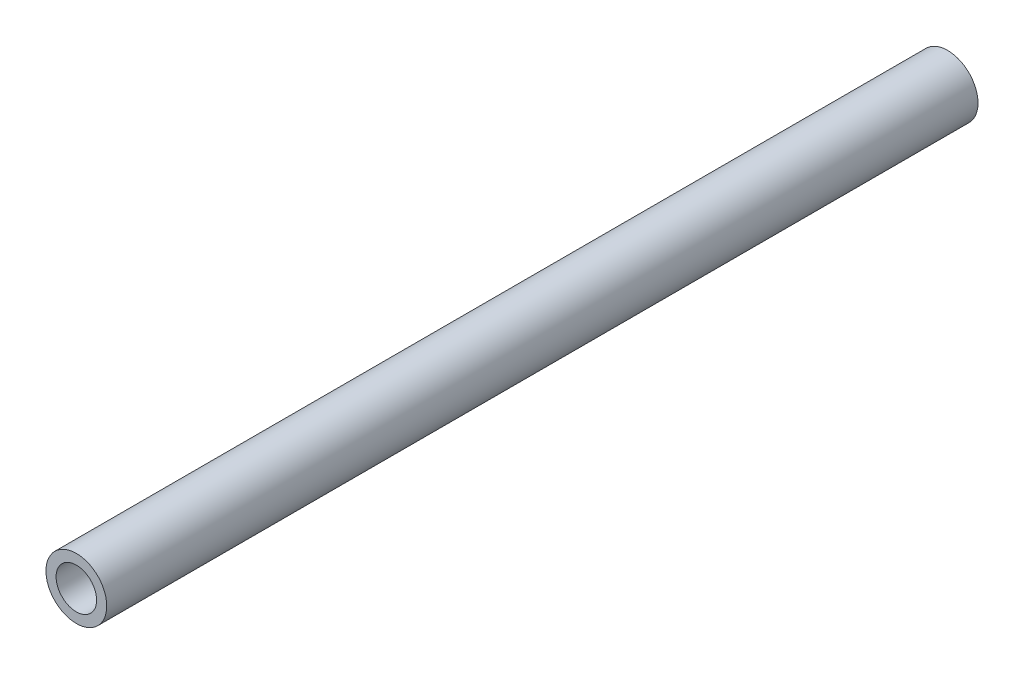
ISO-10303-21;
HEADER;
FILE_DESCRIPTION(('STEP AP214'),'2;1');
FILE_NAME('part.step','',(''),(''),'','','');
FILE_SCHEMA(('AUTOMOTIVE_DESIGN { 1 0 10303 214 1 1 1 1 }'));
ENDSEC;
DATA;
#1=APPLICATION_CONTEXT('core data for automotive mechanical design processes');
#2=APPLICATION_PROTOCOL_DEFINITION('international standard','automotive_design',2000,#1);
#3=PRODUCT_CONTEXT('',#1,'mechanical');
#4=PRODUCT('Part','Part','',(#3));
#5=PRODUCT_RELATED_PRODUCT_CATEGORY('part','',(#4));
#6=PRODUCT_DEFINITION_FORMATION('','',#4);
#7=PRODUCT_DEFINITION_CONTEXT('part definition',#1,'design');
#8=PRODUCT_DEFINITION('design','',#6,#7);
#9=PRODUCT_DEFINITION_SHAPE('','',#8);
#10=(LENGTH_UNIT() NAMED_UNIT(*) SI_UNIT(.MILLI.,.METRE.));
#11=(NAMED_UNIT(*) PLANE_ANGLE_UNIT() SI_UNIT($,.RADIAN.));
#12=(NAMED_UNIT(*) SI_UNIT($,.STERADIAN.) SOLID_ANGLE_UNIT());
#13=UNCERTAINTY_MEASURE_WITH_UNIT(LENGTH_MEASURE(1.E-05),#10,'distance_accuracy_value','');
#14=(GEOMETRIC_REPRESENTATION_CONTEXT(3) GLOBAL_UNCERTAINTY_ASSIGNED_CONTEXT((#13)) GLOBAL_UNIT_ASSIGNED_CONTEXT((#10,
#11,#12)) REPRESENTATION_CONTEXT('',''));
#15=CARTESIAN_POINT('',(0.,0.,0.));
#16=DIRECTION('',(0.,0.,1.));
#17=DIRECTION('',(1.,0.,0.));
#18=AXIS2_PLACEMENT_3D('',#15,#16,#17);
#19=CARTESIAN_POINT('',(0.,0.,86.));
#20=DIRECTION('',(0.,0.,1.));
#21=DIRECTION('',(1.,0.,0.));
#22=AXIS2_PLACEMENT_3D('',#19,#20,#21);
#23=PLANE('',#22);
#24=CARTESIAN_POINT('',(0.,0.,86.));
#25=DIRECTION('',(0.,0.,1.));
#26=DIRECTION('',(1.,0.,0.));
#27=AXIS2_PLACEMENT_3D('',#24,#25,#26);
#28=CIRCLE('',#27,3.);
#29=CARTESIAN_POINT('',(3.,0.,86.));
#30=VERTEX_POINT('',#29);
#31=EDGE_CURVE('E10',#30,#30,#28,.T.);
#32=ORIENTED_EDGE('',*,*,#31,.T.);
#33=EDGE_LOOP('',(#32));
#34=FACE_BOUND('',#33,.T.);
#35=CARTESIAN_POINT('',(0.,0.,86.));
#36=DIRECTION('',(0.,0.,1.));
#37=DIRECTION('',(1.,0.,0.));
#38=AXIS2_PLACEMENT_3D('',#35,#36,#37);
#39=CIRCLE('',#38,2.);
#40=CARTESIAN_POINT('',(2.,0.,86.));
#41=VERTEX_POINT('',#40);
#42=EDGE_CURVE('E40',#41,#41,#39,.T.);
#43=ORIENTED_EDGE('',*,*,#42,.F.);
#44=EDGE_LOOP('',(#43));
#45=FACE_BOUND('',#44,.T.);
#46=ADVANCED_FACE('F29',(#34,#45),#23,.T.);
#47=CARTESIAN_POINT('',(0.,0.,0.));
#48=DIRECTION('',(0.,0.,1.));
#49=DIRECTION('',(1.,0.,0.));
#50=AXIS2_PLACEMENT_3D('',#47,#48,#49);
#51=PLANE('',#50);
#52=CARTESIAN_POINT('',(0.,0.,0.));
#53=DIRECTION('',(0.,0.,1.));
#54=DIRECTION('',(1.,0.,0.));
#55=AXIS2_PLACEMENT_3D('',#52,#53,#54);
#56=CIRCLE('',#55,3.);
#57=CARTESIAN_POINT('',(3.,0.,0.));
#58=VERTEX_POINT('',#57);
#59=EDGE_CURVE('E33',#58,#58,#56,.T.);
#60=ORIENTED_EDGE('',*,*,#59,.F.);
#61=EDGE_LOOP('',(#60));
#62=FACE_BOUND('',#61,.T.);
#63=CARTESIAN_POINT('',(0.,0.,0.));
#64=DIRECTION('',(0.,0.,1.));
#65=DIRECTION('',(1.,0.,0.));
#66=AXIS2_PLACEMENT_3D('',#63,#64,#65);
#67=CIRCLE('',#66,2.);
#68=CARTESIAN_POINT('',(2.,0.,0.));
#69=VERTEX_POINT('',#68);
#70=EDGE_CURVE('E42',#69,#69,#67,.T.);
#71=ORIENTED_EDGE('',*,*,#70,.T.);
#72=EDGE_LOOP('',(#71));
#73=FACE_BOUND('',#72,.T.);
#74=ADVANCED_FACE('F52',(#62,#73),#51,.F.);
#75=CARTESIAN_POINT('',(0.,0.,86.));
#76=DIRECTION('',(0.,0.,-1.));
#77=DIRECTION('',(-1.,0.,0.));
#78=AXIS2_PLACEMENT_3D('',#75,#76,#77);
#79=CYLINDRICAL_SURFACE('',#78,3.);
#80=ORIENTED_EDGE('',*,*,#31,.F.);
#81=EDGE_LOOP('',(#80));
#82=FACE_BOUND('',#81,.T.);
#83=ORIENTED_EDGE('',*,*,#59,.T.);
#84=EDGE_LOOP('',(#83));
#85=FACE_BOUND('',#84,.T.);
#86=ADVANCED_FACE('F31',(#82,#85),#79,.T.);
#87=CARTESIAN_POINT('',(0.,0.,86.));
#88=DIRECTION('',(0.,0.,-1.));
#89=DIRECTION('',(-1.,0.,0.));
#90=AXIS2_PLACEMENT_3D('',#87,#88,#89);
#91=CYLINDRICAL_SURFACE('',#90,2.);
#92=ORIENTED_EDGE('',*,*,#42,.T.);
#93=EDGE_LOOP('',(#92));
#94=FACE_BOUND('',#93,.T.);
#95=ORIENTED_EDGE('',*,*,#70,.F.);
#96=EDGE_LOOP('',(#95));
#97=FACE_BOUND('',#96,.T.);
#98=ADVANCED_FACE('F48',(#94,#97),#91,.F.);
#99=CLOSED_SHELL('',(#46,#74,#86,#98));
#100=MANIFOLD_SOLID_BREP('B2',#99);
#101=ADVANCED_BREP_SHAPE_REPRESENTATION('',(#18,#100),#14);
#102=SHAPE_DEFINITION_REPRESENTATION(#9,#101);
ENDSEC;
END-ISO-10303-21;
